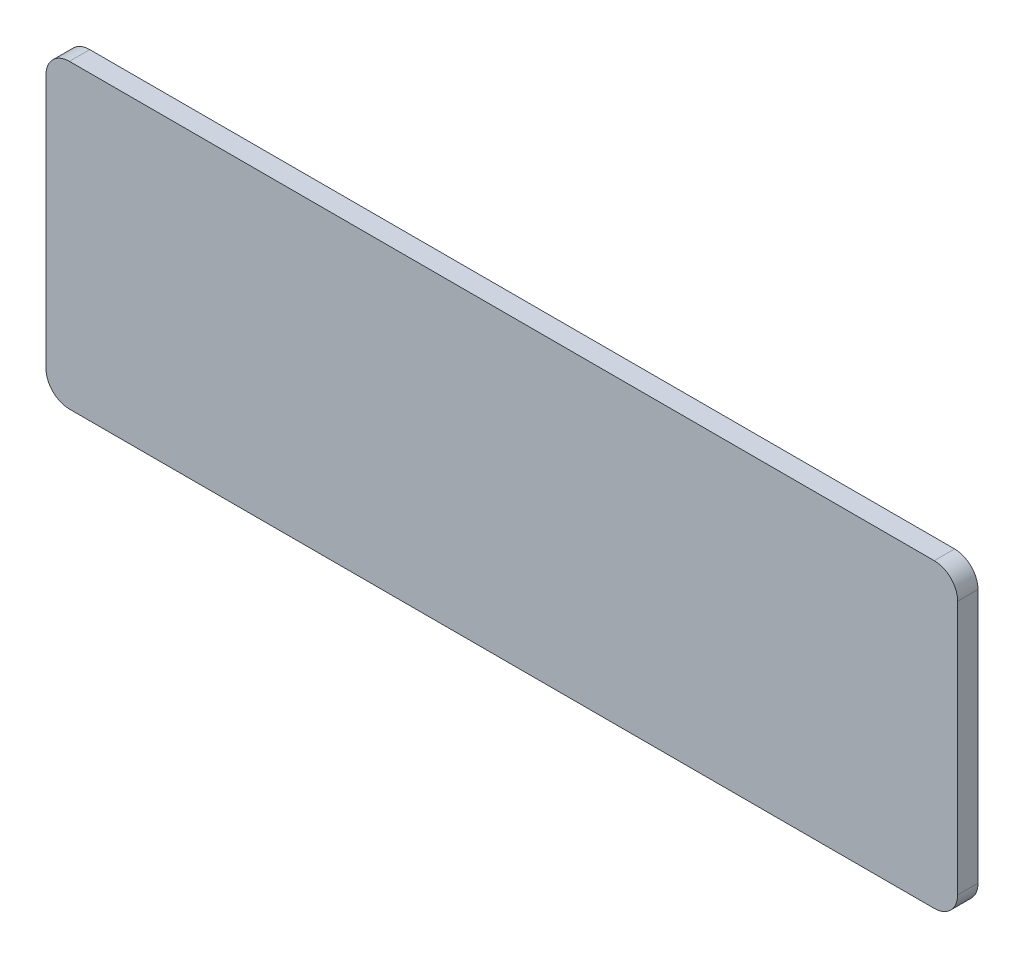
ISO-10303-21;
HEADER;
FILE_DESCRIPTION(('STEP AP214'),'2;1');
FILE_NAME('part.step','',(''),(''),'','','');
FILE_SCHEMA(('AUTOMOTIVE_DESIGN { 1 0 10303 214 1 1 1 1 }'));
ENDSEC;
DATA;
#1=APPLICATION_CONTEXT('core data for automotive mechanical design processes');
#2=APPLICATION_PROTOCOL_DEFINITION('international standard','automotive_design',2000,#1);
#3=PRODUCT_CONTEXT('',#1,'mechanical');
#4=PRODUCT('Part','Part','',(#3));
#5=PRODUCT_RELATED_PRODUCT_CATEGORY('part','',(#4));
#6=PRODUCT_DEFINITION_FORMATION('','',#4);
#7=PRODUCT_DEFINITION_CONTEXT('part definition',#1,'design');
#8=PRODUCT_DEFINITION('design','',#6,#7);
#9=PRODUCT_DEFINITION_SHAPE('','',#8);
#10=(LENGTH_UNIT() NAMED_UNIT(*) SI_UNIT(.MILLI.,.METRE.));
#11=(NAMED_UNIT(*) PLANE_ANGLE_UNIT() SI_UNIT($,.RADIAN.));
#12=(NAMED_UNIT(*) SI_UNIT($,.STERADIAN.) SOLID_ANGLE_UNIT());
#13=UNCERTAINTY_MEASURE_WITH_UNIT(LENGTH_MEASURE(1.E-05),#10,'distance_accuracy_value','');
#14=(GEOMETRIC_REPRESENTATION_CONTEXT(3) GLOBAL_UNCERTAINTY_ASSIGNED_CONTEXT((#13)) GLOBAL_UNIT_ASSIGNED_CONTEXT((#10,
#11,#12)) REPRESENTATION_CONTEXT('',''));
#15=CARTESIAN_POINT('',(0.,0.,0.));
#16=DIRECTION('',(0.,0.,1.));
#17=DIRECTION('',(1.,0.,0.));
#18=AXIS2_PLACEMENT_3D('',#15,#16,#17);
#19=CARTESIAN_POINT('',(123.063,256.61794936658,2.54));
#20=DIRECTION('',(0.,0.,-1.));
#21=DIRECTION('',(-1.,0.,0.));
#22=AXIS2_PLACEMENT_3D('',#19,#20,#21);
#23=CYLINDRICAL_SURFACE('',#22,2.921);
#24=CARTESIAN_POINT('',(123.063,256.61794936658,0.));
#25=DIRECTION('',(0.,0.,1.));
#26=DIRECTION('',(1.,0.,0.));
#27=AXIS2_PLACEMENT_3D('',#24,#25,#26);
#28=CIRCLE('',#27,2.921);
#29=CARTESIAN_POINT('',(125.984,256.61794936658,0.));
#30=VERTEX_POINT('',#29);
#31=CARTESIAN_POINT('',(123.063,259.53894936658,0.));
#32=VERTEX_POINT('',#31);
#33=EDGE_CURVE('E129',#30,#32,#28,.T.);
#34=ORIENTED_EDGE('',*,*,#33,.T.);
#35=DIRECTION('',(0.,0.,-1.));
#36=VECTOR('',#35,1.);
#37=CARTESIAN_POINT('',(123.063,259.53894936658,2.54));
#38=LINE('',#37,#36);
#39=CARTESIAN_POINT('',(123.063,259.53894936658,2.54));
#40=VERTEX_POINT('',#39);
#41=EDGE_CURVE('E11',#40,#32,#38,.T.);
#42=ORIENTED_EDGE('',*,*,#41,.F.);
#43=CARTESIAN_POINT('',(123.063,256.61794936658,2.54));
#44=DIRECTION('',(0.,0.,1.));
#45=DIRECTION('',(1.,0.,0.));
#46=AXIS2_PLACEMENT_3D('',#43,#44,#45);
#47=CIRCLE('',#46,2.921);
#48=CARTESIAN_POINT('',(125.984,256.61794936658,2.54));
#49=VERTEX_POINT('',#48);
#50=EDGE_CURVE('E143',#49,#40,#47,.T.);
#51=ORIENTED_EDGE('',*,*,#50,.F.);
#52=DIRECTION('',(0.,0.,-1.));
#53=VECTOR('',#52,1.);
#54=CARTESIAN_POINT('',(125.984,256.61794936658,2.54));
#55=LINE('',#54,#53);
#56=EDGE_CURVE('E125',#49,#30,#55,.T.);
#57=ORIENTED_EDGE('',*,*,#56,.T.);
#58=EDGE_LOOP('',(#34,#42,#51,#57));
#59=FACE_BOUND('',#58,.T.);
#60=ADVANCED_FACE('F33',(#59),#23,.T.);
#61=CARTESIAN_POINT('',(123.063,259.53894936658,2.54));
#62=DIRECTION('',(0.,-1.,0.));
#63=DIRECTION('',(0.,0.,-1.));
#64=AXIS2_PLACEMENT_3D('',#61,#62,#63);
#65=PLANE('',#64);
#66=DIRECTION('',(-1.,0.,0.));
#67=VECTOR('',#66,1.);
#68=CARTESIAN_POINT('',(123.063,259.53894936658,0.));
#69=LINE('',#68,#67);
#70=CARTESIAN_POINT('',(15.113,259.53894936658,0.));
#71=VERTEX_POINT('',#70);
#72=EDGE_CURVE('E132',#32,#71,#69,.T.);
#73=ORIENTED_EDGE('',*,*,#72,.T.);
#74=DIRECTION('',(0.,0.,-1.));
#75=VECTOR('',#74,1.);
#76=CARTESIAN_POINT('',(15.113,259.53894936658,2.54));
#77=LINE('',#76,#75);
#78=CARTESIAN_POINT('',(15.113,259.53894936658,2.54));
#79=VERTEX_POINT('',#78);
#80=EDGE_CURVE('E41',#79,#71,#77,.T.);
#81=ORIENTED_EDGE('',*,*,#80,.F.);
#82=DIRECTION('',(-1.,0.,0.));
#83=VECTOR('',#82,1.);
#84=CARTESIAN_POINT('',(123.063,259.53894936658,2.54));
#85=LINE('',#84,#83);
#86=EDGE_CURVE('E92',#40,#79,#85,.T.);
#87=ORIENTED_EDGE('',*,*,#86,.F.);
#88=ORIENTED_EDGE('',*,*,#41,.T.);
#89=EDGE_LOOP('',(#73,#81,#87,#88));
#90=FACE_BOUND('',#89,.T.);
#91=ADVANCED_FACE('F178',(#90),#65,.F.);
#92=CARTESIAN_POINT('',(15.1130000000001,256.61794936658,2.54));
#93=DIRECTION('',(0.,0.,-1.));
#94=DIRECTION('',(-1.,0.,0.));
#95=AXIS2_PLACEMENT_3D('',#92,#93,#94);
#96=CYLINDRICAL_SURFACE('',#95,2.92100000000011);
#97=CARTESIAN_POINT('',(15.1130000000001,256.61794936658,0.));
#98=DIRECTION('',(0.,0.,1.));
#99=DIRECTION('',(1.,0.,0.));
#100=AXIS2_PLACEMENT_3D('',#97,#98,#99);
#101=CIRCLE('',#100,2.92100000000011);
#102=CARTESIAN_POINT('',(12.192,256.61794936658,0.));
#103=VERTEX_POINT('',#102);
#104=EDGE_CURVE('E134',#71,#103,#101,.T.);
#105=ORIENTED_EDGE('',*,*,#104,.T.);
#106=DIRECTION('',(0.,0.,-1.));
#107=VECTOR('',#106,1.);
#108=CARTESIAN_POINT('',(12.192,256.61794936658,2.54));
#109=LINE('',#108,#107);
#110=CARTESIAN_POINT('',(12.192,256.61794936658,2.54));
#111=VERTEX_POINT('',#110);
#112=EDGE_CURVE('E150',#111,#103,#109,.T.);
#113=ORIENTED_EDGE('',*,*,#112,.F.);
#114=CARTESIAN_POINT('',(15.1130000000001,256.61794936658,2.54));
#115=DIRECTION('',(0.,0.,1.));
#116=DIRECTION('',(1.,0.,0.));
#117=AXIS2_PLACEMENT_3D('',#114,#115,#116);
#118=CIRCLE('',#117,2.92100000000011);
#119=EDGE_CURVE('E158',#79,#111,#118,.T.);
#120=ORIENTED_EDGE('',*,*,#119,.F.);
#121=ORIENTED_EDGE('',*,*,#80,.T.);
#122=EDGE_LOOP('',(#105,#113,#120,#121));
#123=FACE_BOUND('',#122,.T.);
#124=ADVANCED_FACE('F156',(#123),#96,.T.);
#125=CARTESIAN_POINT('',(12.192,256.61794936658,2.54));
#126=DIRECTION('',(1.,0.,0.));
#127=DIRECTION('',(0.,1.,0.));
#128=AXIS2_PLACEMENT_3D('',#125,#126,#127);
#129=PLANE('',#128);
#130=DIRECTION('',(0.,-1.,0.));
#131=VECTOR('',#130,1.);
#132=CARTESIAN_POINT('',(12.192,256.61794936658,0.));
#133=LINE('',#132,#131);
#134=CARTESIAN_POINT('',(12.192,224.86794936658,0.));
#135=VERTEX_POINT('',#134);
#136=EDGE_CURVE('E136',#103,#135,#133,.T.);
#137=ORIENTED_EDGE('',*,*,#136,.T.);
#138=DIRECTION('',(0.,0.,-1.));
#139=VECTOR('',#138,1.);
#140=CARTESIAN_POINT('',(12.192,224.86794936658,2.54));
#141=LINE('',#140,#139);
#142=CARTESIAN_POINT('',(12.192,224.86794936658,2.54));
#143=VERTEX_POINT('',#142);
#144=EDGE_CURVE('E147',#143,#135,#141,.T.);
#145=ORIENTED_EDGE('',*,*,#144,.F.);
#146=DIRECTION('',(0.,-1.,0.));
#147=VECTOR('',#146,1.);
#148=CARTESIAN_POINT('',(12.192,256.61794936658,2.54));
#149=LINE('',#148,#147);
#150=EDGE_CURVE('E170',#111,#143,#149,.T.);
#151=ORIENTED_EDGE('',*,*,#150,.F.);
#152=ORIENTED_EDGE('',*,*,#112,.T.);
#153=EDGE_LOOP('',(#137,#145,#151,#152));
#154=FACE_BOUND('',#153,.T.);
#155=ADVANCED_FACE('F166',(#154),#129,.F.);
#156=CARTESIAN_POINT('',(15.113,224.86794936658,2.54));
#157=DIRECTION('',(0.,0.,-1.));
#158=DIRECTION('',(-1.,0.,0.));
#159=AXIS2_PLACEMENT_3D('',#156,#157,#158);
#160=CYLINDRICAL_SURFACE('',#159,2.92099999999995);
#161=CARTESIAN_POINT('',(15.113,224.86794936658,0.));
#162=DIRECTION('',(0.,0.,1.));
#163=DIRECTION('',(1.,0.,0.));
#164=AXIS2_PLACEMENT_3D('',#161,#162,#163);
#165=CIRCLE('',#164,2.92099999999995);
#166=CARTESIAN_POINT('',(15.113,221.94694936658,0.));
#167=VERTEX_POINT('',#166);
#168=EDGE_CURVE('E138',#135,#167,#165,.T.);
#169=ORIENTED_EDGE('',*,*,#168,.T.);
#170=DIRECTION('',(0.,0.,-1.));
#171=VECTOR('',#170,1.);
#172=CARTESIAN_POINT('',(15.113,221.94694936658,2.54));
#173=LINE('',#172,#171);
#174=CARTESIAN_POINT('',(15.113,221.94694936658,2.54));
#175=VERTEX_POINT('',#174);
#176=EDGE_CURVE('E120',#175,#167,#173,.T.);
#177=ORIENTED_EDGE('',*,*,#176,.F.);
#178=CARTESIAN_POINT('',(15.113,224.86794936658,2.54));
#179=DIRECTION('',(0.,0.,1.));
#180=DIRECTION('',(1.,0.,0.));
#181=AXIS2_PLACEMENT_3D('',#178,#179,#180);
#182=CIRCLE('',#181,2.92099999999995);
#183=EDGE_CURVE('E111',#143,#175,#182,.T.);
#184=ORIENTED_EDGE('',*,*,#183,.F.);
#185=ORIENTED_EDGE('',*,*,#144,.T.);
#186=EDGE_LOOP('',(#169,#177,#184,#185));
#187=FACE_BOUND('',#186,.T.);
#188=ADVANCED_FACE('F169',(#187),#160,.T.);
#189=CARTESIAN_POINT('',(15.113,221.94694936658,2.54));
#190=DIRECTION('',(0.,1.,0.));
#191=DIRECTION('',(0.,0.,1.));
#192=AXIS2_PLACEMENT_3D('',#189,#190,#191);
#193=PLANE('',#192);
#194=DIRECTION('',(1.,0.,0.));
#195=VECTOR('',#194,1.);
#196=CARTESIAN_POINT('',(15.113,221.94694936658,0.));
#197=LINE('',#196,#195);
#198=CARTESIAN_POINT('',(123.063,221.94694936658,0.));
#199=VERTEX_POINT('',#198);
#200=EDGE_CURVE('E119',#167,#199,#197,.T.);
#201=ORIENTED_EDGE('',*,*,#200,.T.);
#202=DIRECTION('',(0.,0.,-1.));
#203=VECTOR('',#202,1.);
#204=CARTESIAN_POINT('',(123.063,221.94694936658,2.54));
#205=LINE('',#204,#203);
#206=CARTESIAN_POINT('',(123.063,221.94694936658,2.54));
#207=VERTEX_POINT('',#206);
#208=EDGE_CURVE('E116',#207,#199,#205,.T.);
#209=ORIENTED_EDGE('',*,*,#208,.F.);
#210=DIRECTION('',(1.,0.,0.));
#211=VECTOR('',#210,1.);
#212=CARTESIAN_POINT('',(15.113,221.94694936658,2.54));
#213=LINE('',#212,#211);
#214=EDGE_CURVE('E105',#175,#207,#213,.T.);
#215=ORIENTED_EDGE('',*,*,#214,.F.);
#216=ORIENTED_EDGE('',*,*,#176,.T.);
#217=EDGE_LOOP('',(#201,#209,#215,#216));
#218=FACE_BOUND('',#217,.T.);
#219=ADVANCED_FACE('F117',(#218),#193,.F.);
#220=CARTESIAN_POINT('',(123.063,224.86794936658,2.54));
#221=DIRECTION('',(0.,0.,-1.));
#222=DIRECTION('',(-1.,0.,0.));
#223=AXIS2_PLACEMENT_3D('',#220,#221,#222);
#224=CYLINDRICAL_SURFACE('',#223,2.92099999999999);
#225=CARTESIAN_POINT('',(123.063,224.86794936658,0.));
#226=DIRECTION('',(0.,0.,1.));
#227=DIRECTION('',(1.,0.,0.));
#228=AXIS2_PLACEMENT_3D('',#225,#226,#227);
#229=CIRCLE('',#228,2.92099999999999);
#230=CARTESIAN_POINT('',(125.984,224.86794936658,0.));
#231=VERTEX_POINT('',#230);
#232=EDGE_CURVE('E78',#199,#231,#229,.T.);
#233=ORIENTED_EDGE('',*,*,#232,.T.);
#234=DIRECTION('',(0.,0.,-1.));
#235=VECTOR('',#234,1.);
#236=CARTESIAN_POINT('',(125.984,224.86794936658,2.54));
#237=LINE('',#236,#235);
#238=CARTESIAN_POINT('',(125.984,224.86794936658,2.54));
#239=VERTEX_POINT('',#238);
#240=EDGE_CURVE('E121',#239,#231,#237,.T.);
#241=ORIENTED_EDGE('',*,*,#240,.F.);
#242=CARTESIAN_POINT('',(123.063,224.86794936658,2.54));
#243=DIRECTION('',(0.,0.,1.));
#244=DIRECTION('',(1.,0.,0.));
#245=AXIS2_PLACEMENT_3D('',#242,#243,#244);
#246=CIRCLE('',#245,2.92099999999999);
#247=EDGE_CURVE('E109',#207,#239,#246,.T.);
#248=ORIENTED_EDGE('',*,*,#247,.F.);
#249=ORIENTED_EDGE('',*,*,#208,.T.);
#250=EDGE_LOOP('',(#233,#241,#248,#249));
#251=FACE_BOUND('',#250,.T.);
#252=ADVANCED_FACE('F123',(#251),#224,.T.);
#253=CARTESIAN_POINT('',(125.984,224.86794936658,2.54));
#254=DIRECTION('',(-1.,0.,0.));
#255=DIRECTION('',(0.,0.,1.));
#256=AXIS2_PLACEMENT_3D('',#253,#254,#255);
#257=PLANE('',#256);
#258=DIRECTION('',(0.,1.,0.));
#259=VECTOR('',#258,1.);
#260=CARTESIAN_POINT('',(125.984,224.86794936658,0.));
#261=LINE('',#260,#259);
#262=EDGE_CURVE('E84',#231,#30,#261,.T.);
#263=ORIENTED_EDGE('',*,*,#262,.T.);
#264=ORIENTED_EDGE('',*,*,#56,.F.);
#265=DIRECTION('',(0.,1.,0.));
#266=VECTOR('',#265,1.);
#267=CARTESIAN_POINT('',(125.984,224.86794936658,2.54));
#268=LINE('',#267,#266);
#269=EDGE_CURVE('E49',#239,#49,#268,.T.);
#270=ORIENTED_EDGE('',*,*,#269,.F.);
#271=ORIENTED_EDGE('',*,*,#240,.T.);
#272=EDGE_LOOP('',(#263,#264,#270,#271));
#273=FACE_BOUND('',#272,.T.);
#274=ADVANCED_FACE('F194',(#273),#257,.F.);
#275=CARTESIAN_POINT('',(123.063,256.61794936658,2.54));
#276=DIRECTION('',(0.,0.,1.));
#277=DIRECTION('',(1.,0.,0.));
#278=AXIS2_PLACEMENT_3D('',#275,#276,#277);
#279=PLANE('',#278);
#280=ORIENTED_EDGE('',*,*,#50,.T.);
#281=ORIENTED_EDGE('',*,*,#86,.T.);
#282=ORIENTED_EDGE('',*,*,#119,.T.);
#283=ORIENTED_EDGE('',*,*,#150,.T.);
#284=ORIENTED_EDGE('',*,*,#183,.T.);
#285=ORIENTED_EDGE('',*,*,#214,.T.);
#286=ORIENTED_EDGE('',*,*,#247,.T.);
#287=ORIENTED_EDGE('',*,*,#269,.T.);
#288=EDGE_LOOP('',(#280,#281,#282,#283,#284,#285,#286,#287));
#289=FACE_BOUND('',#288,.T.);
#290=ADVANCED_FACE('F107',(#289),#279,.T.);
#291=CARTESIAN_POINT('',(123.063,256.61794936658,0.));
#292=DIRECTION('',(0.,0.,1.));
#293=DIRECTION('',(1.,0.,0.));
#294=AXIS2_PLACEMENT_3D('',#291,#292,#293);
#295=PLANE('',#294);
#296=ORIENTED_EDGE('',*,*,#33,.F.);
#297=ORIENTED_EDGE('',*,*,#262,.F.);
#298=ORIENTED_EDGE('',*,*,#232,.F.);
#299=ORIENTED_EDGE('',*,*,#200,.F.);
#300=ORIENTED_EDGE('',*,*,#168,.F.);
#301=ORIENTED_EDGE('',*,*,#136,.F.);
#302=ORIENTED_EDGE('',*,*,#104,.F.);
#303=ORIENTED_EDGE('',*,*,#72,.F.);
#304=EDGE_LOOP('',(#296,#297,#298,#299,#300,#301,#302,#303));
#305=FACE_BOUND('',#304,.T.);
#306=ADVANCED_FACE('F162',(#305),#295,.F.);
#307=CLOSED_SHELL('',(#60,#91,#124,#155,#188,#219,#252,#274,#290,#306));
#308=MANIFOLD_SOLID_BREP('B2',#307);
#309=ADVANCED_BREP_SHAPE_REPRESENTATION('',(#18,#308),#14);
#310=SHAPE_DEFINITION_REPRESENTATION(#9,#309);
ENDSEC;
END-ISO-10303-21;
